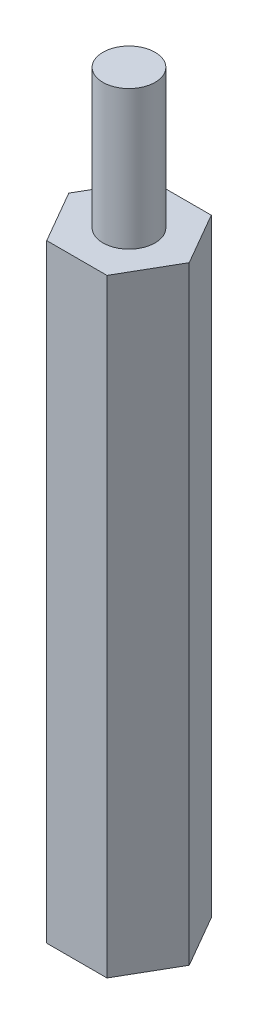
ISO-10303-21;
HEADER;
FILE_DESCRIPTION(('STEP AP214'),'2;1');
FILE_NAME('part.step','',(''),(''),'','','');
FILE_SCHEMA(('AUTOMOTIVE_DESIGN { 1 0 10303 214 1 1 1 1 }'));
ENDSEC;
DATA;
#1=APPLICATION_CONTEXT('core data for automotive mechanical design processes');
#2=APPLICATION_PROTOCOL_DEFINITION('international standard','automotive_design',2000,#1);
#3=PRODUCT_CONTEXT('',#1,'mechanical');
#4=PRODUCT('Part','Part','',(#3));
#5=PRODUCT_RELATED_PRODUCT_CATEGORY('part','',(#4));
#6=PRODUCT_DEFINITION_FORMATION('','',#4);
#7=PRODUCT_DEFINITION_CONTEXT('part definition',#1,'design');
#8=PRODUCT_DEFINITION('design','',#6,#7);
#9=PRODUCT_DEFINITION_SHAPE('','',#8);
#10=(LENGTH_UNIT() NAMED_UNIT(*) SI_UNIT(.MILLI.,.METRE.));
#11=(NAMED_UNIT(*) PLANE_ANGLE_UNIT() SI_UNIT($,.RADIAN.));
#12=(NAMED_UNIT(*) SI_UNIT($,.STERADIAN.) SOLID_ANGLE_UNIT());
#13=UNCERTAINTY_MEASURE_WITH_UNIT(LENGTH_MEASURE(1.E-05),#10,'distance_accuracy_value','');
#14=(GEOMETRIC_REPRESENTATION_CONTEXT(3) GLOBAL_UNCERTAINTY_ASSIGNED_CONTEXT((#13)) GLOBAL_UNIT_ASSIGNED_CONTEXT((#10,
#11,#12)) REPRESENTATION_CONTEXT('',''));
#15=CARTESIAN_POINT('',(0.,0.,0.));
#16=DIRECTION('',(0.,0.,1.));
#17=DIRECTION('',(1.,0.,0.));
#18=AXIS2_PLACEMENT_3D('',#15,#16,#17);
#19=CARTESIAN_POINT('',(-1.73205080756887,35.,3.));
#20=DIRECTION('',(0.,0.,-1.));
#21=DIRECTION('',(-1.,0.,0.));
#22=AXIS2_PLACEMENT_3D('',#19,#20,#21);
#23=PLANE('',#22);
#24=DIRECTION('',(1.,0.,0.));
#25=VECTOR('',#24,1.);
#26=CARTESIAN_POINT('',(-1.73205080756887,0.,3.));
#27=LINE('',#26,#25);
#28=CARTESIAN_POINT('',(-1.73205080756887,0.,3.));
#29=VERTEX_POINT('',#28);
#30=CARTESIAN_POINT('',(1.73205080756888,0.,3.));
#31=VERTEX_POINT('',#30);
#32=EDGE_CURVE('E122',#29,#31,#27,.T.);
#33=ORIENTED_EDGE('',*,*,#32,.T.);
#34=DIRECTION('',(0.,-1.,0.));
#35=VECTOR('',#34,1.);
#36=CARTESIAN_POINT('',(1.73205080756888,35.,3.));
#37=LINE('',#36,#35);
#38=CARTESIAN_POINT('',(1.73205080756888,35.,3.));
#39=VERTEX_POINT('',#38);
#40=EDGE_CURVE('E39',#39,#31,#37,.T.);
#41=ORIENTED_EDGE('',*,*,#40,.F.);
#42=DIRECTION('',(1.,0.,0.));
#43=VECTOR('',#42,1.);
#44=CARTESIAN_POINT('',(-1.73205080756887,35.,3.));
#45=LINE('',#44,#43);
#46=CARTESIAN_POINT('',(-1.73205080756887,35.,3.));
#47=VERTEX_POINT('',#46);
#48=EDGE_CURVE('E133',#47,#39,#45,.T.);
#49=ORIENTED_EDGE('',*,*,#48,.F.);
#50=DIRECTION('',(0.,-1.,0.));
#51=VECTOR('',#50,1.);
#52=CARTESIAN_POINT('',(-1.73205080756887,35.,3.));
#53=LINE('',#52,#51);
#54=EDGE_CURVE('E118',#47,#29,#53,.T.);
#55=ORIENTED_EDGE('',*,*,#54,.T.);
#56=EDGE_LOOP('',(#33,#41,#49,#55));
#57=FACE_BOUND('',#56,.T.);
#58=ADVANCED_FACE('F36',(#57),#23,.F.);
#59=CARTESIAN_POINT('',(1.73205080756888,35.,3.));
#60=DIRECTION('',(-0.866025403784439,0.,-0.5));
#61=DIRECTION('',(-0.5,0.,0.866025403784439));
#62=AXIS2_PLACEMENT_3D('',#59,#60,#61);
#63=PLANE('',#62);
#64=DIRECTION('',(0.5,0.,-0.866025403784439));
#65=VECTOR('',#64,1.);
#66=CARTESIAN_POINT('',(1.73205080756888,0.,3.));
#67=LINE('',#66,#65);
#68=CARTESIAN_POINT('',(3.46410161513775,0.,0.));
#69=VERTEX_POINT('',#68);
#70=EDGE_CURVE('E125',#31,#69,#67,.T.);
#71=ORIENTED_EDGE('',*,*,#70,.T.);
#72=DIRECTION('',(0.,-1.,0.));
#73=VECTOR('',#72,1.);
#74=CARTESIAN_POINT('',(3.46410161513775,35.,0.));
#75=LINE('',#74,#73);
#76=CARTESIAN_POINT('',(3.46410161513775,35.,0.));
#77=VERTEX_POINT('',#76);
#78=EDGE_CURVE('E136',#77,#69,#75,.T.);
#79=ORIENTED_EDGE('',*,*,#78,.F.);
#80=DIRECTION('',(0.5,0.,-0.866025403784439));
#81=VECTOR('',#80,1.);
#82=CARTESIAN_POINT('',(1.73205080756888,35.,3.));
#83=LINE('',#82,#81);
#84=EDGE_CURVE('E91',#39,#77,#83,.T.);
#85=ORIENTED_EDGE('',*,*,#84,.F.);
#86=ORIENTED_EDGE('',*,*,#40,.T.);
#87=EDGE_LOOP('',(#71,#79,#85,#86));
#88=FACE_BOUND('',#87,.T.);
#89=ADVANCED_FACE('F141',(#88),#63,.F.);
#90=CARTESIAN_POINT('',(3.46410161513775,35.,0.));
#91=DIRECTION('',(-0.866025403784439,0.,0.5));
#92=DIRECTION('',(0.5,0.,0.866025403784439));
#93=AXIS2_PLACEMENT_3D('',#90,#91,#92);
#94=PLANE('',#93);
#95=DIRECTION('',(-0.5,0.,-0.866025403784438));
#96=VECTOR('',#95,1.);
#97=CARTESIAN_POINT('',(3.46410161513775,0.,0.));
#98=LINE('',#97,#96);
#99=CARTESIAN_POINT('',(1.73205080756888,0.,-3.));
#100=VERTEX_POINT('',#99);
#101=EDGE_CURVE('E128',#69,#100,#98,.T.);
#102=ORIENTED_EDGE('',*,*,#101,.T.);
#103=DIRECTION('',(0.,-1.,0.));
#104=VECTOR('',#103,1.);
#105=CARTESIAN_POINT('',(1.73205080756888,35.,-3.));
#106=LINE('',#105,#104);
#107=CARTESIAN_POINT('',(1.73205080756888,35.,-3.));
#108=VERTEX_POINT('',#107);
#109=EDGE_CURVE('E113',#108,#100,#106,.T.);
#110=ORIENTED_EDGE('',*,*,#109,.F.);
#111=DIRECTION('',(-0.5,0.,-0.866025403784438));
#112=VECTOR('',#111,1.);
#113=CARTESIAN_POINT('',(3.46410161513775,35.,0.));
#114=LINE('',#113,#112);
#115=EDGE_CURVE('E104',#77,#108,#114,.T.);
#116=ORIENTED_EDGE('',*,*,#115,.F.);
#117=ORIENTED_EDGE('',*,*,#78,.T.);
#118=EDGE_LOOP('',(#102,#110,#116,#117));
#119=FACE_BOUND('',#118,.T.);
#120=ADVANCED_FACE('F147',(#119),#94,.F.);
#121=CARTESIAN_POINT('',(1.73205080756888,35.,-3.));
#122=DIRECTION('',(0.,0.,1.));
#123=DIRECTION('',(1.,0.,0.));
#124=AXIS2_PLACEMENT_3D('',#121,#122,#123);
#125=PLANE('',#124);
#126=DIRECTION('',(-1.,0.,0.));
#127=VECTOR('',#126,1.);
#128=CARTESIAN_POINT('',(1.73205080756888,0.,-3.));
#129=LINE('',#128,#127);
#130=CARTESIAN_POINT('',(-1.73205080756888,0.,-3.));
#131=VERTEX_POINT('',#130);
#132=EDGE_CURVE('E112',#100,#131,#129,.T.);
#133=ORIENTED_EDGE('',*,*,#132,.T.);
#134=DIRECTION('',(0.,-1.,0.));
#135=VECTOR('',#134,1.);
#136=CARTESIAN_POINT('',(-1.73205080756888,35.,-3.));
#137=LINE('',#136,#135);
#138=CARTESIAN_POINT('',(-1.73205080756888,35.,-3.));
#139=VERTEX_POINT('',#138);
#140=EDGE_CURVE('E109',#139,#131,#137,.T.);
#141=ORIENTED_EDGE('',*,*,#140,.F.);
#142=DIRECTION('',(-1.,0.,0.));
#143=VECTOR('',#142,1.);
#144=CARTESIAN_POINT('',(1.73205080756888,35.,-3.));
#145=LINE('',#144,#143);
#146=EDGE_CURVE('E98',#108,#139,#145,.T.);
#147=ORIENTED_EDGE('',*,*,#146,.F.);
#148=ORIENTED_EDGE('',*,*,#109,.T.);
#149=EDGE_LOOP('',(#133,#141,#147,#148));
#150=FACE_BOUND('',#149,.T.);
#151=ADVANCED_FACE('F110',(#150),#125,.F.);
#152=CARTESIAN_POINT('',(-1.73205080756888,35.,-3.));
#153=DIRECTION('',(0.866025403784439,0.,0.5));
#154=DIRECTION('',(0.5,0.,-0.866025403784439));
#155=AXIS2_PLACEMENT_3D('',#152,#153,#154);
#156=PLANE('',#155);
#157=DIRECTION('',(-0.5,0.,0.866025403784439));
#158=VECTOR('',#157,1.);
#159=CARTESIAN_POINT('',(-1.73205080756888,0.,-3.));
#160=LINE('',#159,#158);
#161=CARTESIAN_POINT('',(-3.46410161513775,0.,0.));
#162=VERTEX_POINT('',#161);
#163=EDGE_CURVE('E76',#131,#162,#160,.T.);
#164=ORIENTED_EDGE('',*,*,#163,.T.);
#165=DIRECTION('',(0.,-1.,0.));
#166=VECTOR('',#165,1.);
#167=CARTESIAN_POINT('',(-3.46410161513775,35.,0.));
#168=LINE('',#167,#166);
#169=CARTESIAN_POINT('',(-3.46410161513775,35.,0.));
#170=VERTEX_POINT('',#169);
#171=EDGE_CURVE('E114',#170,#162,#168,.T.);
#172=ORIENTED_EDGE('',*,*,#171,.F.);
#173=DIRECTION('',(-0.5,0.,0.866025403784439));
#174=VECTOR('',#173,1.);
#175=CARTESIAN_POINT('',(-1.73205080756888,35.,-3.));
#176=LINE('',#175,#174);
#177=EDGE_CURVE('E102',#139,#170,#176,.T.);
#178=ORIENTED_EDGE('',*,*,#177,.F.);
#179=ORIENTED_EDGE('',*,*,#140,.T.);
#180=EDGE_LOOP('',(#164,#172,#178,#179));
#181=FACE_BOUND('',#180,.T.);
#182=ADVANCED_FACE('F116',(#181),#156,.F.);
#183=CARTESIAN_POINT('',(-3.46410161513775,35.,0.));
#184=DIRECTION('',(0.866025403784438,0.,-0.5));
#185=DIRECTION('',(-0.500000000000001,0.,-0.866025403784438));
#186=AXIS2_PLACEMENT_3D('',#183,#184,#185);
#187=PLANE('',#186);
#188=DIRECTION('',(0.500000000000001,0.,0.866025403784438));
#189=VECTOR('',#188,1.);
#190=CARTESIAN_POINT('',(-3.46410161513775,0.,0.));
#191=LINE('',#190,#189);
#192=EDGE_CURVE('E82',#162,#29,#191,.T.);
#193=ORIENTED_EDGE('',*,*,#192,.T.);
#194=ORIENTED_EDGE('',*,*,#54,.F.);
#195=DIRECTION('',(0.500000000000001,0.,0.866025403784438));
#196=VECTOR('',#195,1.);
#197=CARTESIAN_POINT('',(-3.46410161513775,35.,0.));
#198=LINE('',#197,#196);
#199=EDGE_CURVE('E53',#170,#47,#198,.T.);
#200=ORIENTED_EDGE('',*,*,#199,.F.);
#201=ORIENTED_EDGE('',*,*,#171,.T.);
#202=EDGE_LOOP('',(#193,#194,#200,#201));
#203=FACE_BOUND('',#202,.T.);
#204=ADVANCED_FACE('F163',(#203),#187,.F.);
#205=CARTESIAN_POINT('',(0.,35.,0.));
#206=DIRECTION('',(0.,1.,0.));
#207=DIRECTION('',(0.,0.,1.));
#208=AXIS2_PLACEMENT_3D('',#205,#206,#207);
#209=PLANE('',#208);
#210=CARTESIAN_POINT('',(0.,35.,0.));
#211=DIRECTION('',(0.,1.,0.));
#212=DIRECTION('',(0.,0.,1.));
#213=AXIS2_PLACEMENT_3D('',#210,#211,#212);
#214=CIRCLE('',#213,1.5);
#215=CARTESIAN_POINT('',(0.,35.,1.5));
#216=VERTEX_POINT('',#215);
#217=EDGE_CURVE('E11',#216,#216,#214,.T.);
#218=ORIENTED_EDGE('',*,*,#217,.F.);
#219=EDGE_LOOP('',(#218));
#220=FACE_BOUND('',#219,.T.);
#221=ORIENTED_EDGE('',*,*,#48,.T.);
#222=ORIENTED_EDGE('',*,*,#84,.T.);
#223=ORIENTED_EDGE('',*,*,#115,.T.);
#224=ORIENTED_EDGE('',*,*,#146,.T.);
#225=ORIENTED_EDGE('',*,*,#177,.T.);
#226=ORIENTED_EDGE('',*,*,#199,.T.);
#227=EDGE_LOOP('',(#221,#222,#223,#224,#225,#226));
#228=FACE_BOUND('',#227,.T.);
#229=ADVANCED_FACE('F100',(#220,#228),#209,.T.);
#230=CARTESIAN_POINT('',(0.,0.,0.));
#231=DIRECTION('',(0.,1.,0.));
#232=DIRECTION('',(0.,0.,1.));
#233=AXIS2_PLACEMENT_3D('',#230,#231,#232);
#234=PLANE('',#233);
#235=ORIENTED_EDGE('',*,*,#32,.F.);
#236=ORIENTED_EDGE('',*,*,#192,.F.);
#237=ORIENTED_EDGE('',*,*,#163,.F.);
#238=ORIENTED_EDGE('',*,*,#132,.F.);
#239=ORIENTED_EDGE('',*,*,#101,.F.);
#240=ORIENTED_EDGE('',*,*,#70,.F.);
#241=EDGE_LOOP('',(#235,#236,#237,#238,#239,#240));
#242=FACE_BOUND('',#241,.T.);
#243=ADVANCED_FACE('F146',(#242),#234,.F.);
#244=CARTESIAN_POINT('',(0.,43.,0.));
#245=DIRECTION('',(0.,-1.,0.));
#246=DIRECTION('',(0.,0.,-1.));
#247=AXIS2_PLACEMENT_3D('',#244,#245,#246);
#248=CYLINDRICAL_SURFACE('',#247,1.5);
#249=CARTESIAN_POINT('',(0.,43.,0.));
#250=DIRECTION('',(0.,1.,0.));
#251=DIRECTION('',(0.,0.,1.));
#252=AXIS2_PLACEMENT_3D('',#249,#250,#251);
#253=CIRCLE('',#252,1.5);
#254=CARTESIAN_POINT('',(0.,43.,1.5));
#255=VERTEX_POINT('',#254);
#256=EDGE_CURVE('E126',#255,#255,#253,.T.);
#257=ORIENTED_EDGE('',*,*,#256,.F.);
#258=EDGE_LOOP('',(#257));
#259=FACE_BOUND('',#258,.T.);
#260=ORIENTED_EDGE('',*,*,#217,.T.);
#261=EDGE_LOOP('',(#260));
#262=FACE_BOUND('',#261,.T.);
#263=ADVANCED_FACE('F156',(#259,#262),#248,.T.);
#264=CARTESIAN_POINT('',(0.,43.,0.));
#265=DIRECTION('',(0.,1.,0.));
#266=DIRECTION('',(0.,0.,1.));
#267=AXIS2_PLACEMENT_3D('',#264,#265,#266);
#268=PLANE('',#267);
#269=ORIENTED_EDGE('',*,*,#256,.T.);
#270=EDGE_LOOP('',(#269));
#271=FACE_BOUND('',#270,.T.);
#272=ADVANCED_FACE('F154',(#271),#268,.T.);
#273=CLOSED_SHELL('',(#58,#89,#120,#151,#182,#204,#229,#243,#263,#272));
#274=MANIFOLD_SOLID_BREP('B2',#273);
#275=ADVANCED_BREP_SHAPE_REPRESENTATION('',(#18,#274),#14);
#276=SHAPE_DEFINITION_REPRESENTATION(#9,#275);
ENDSEC;
END-ISO-10303-21;
